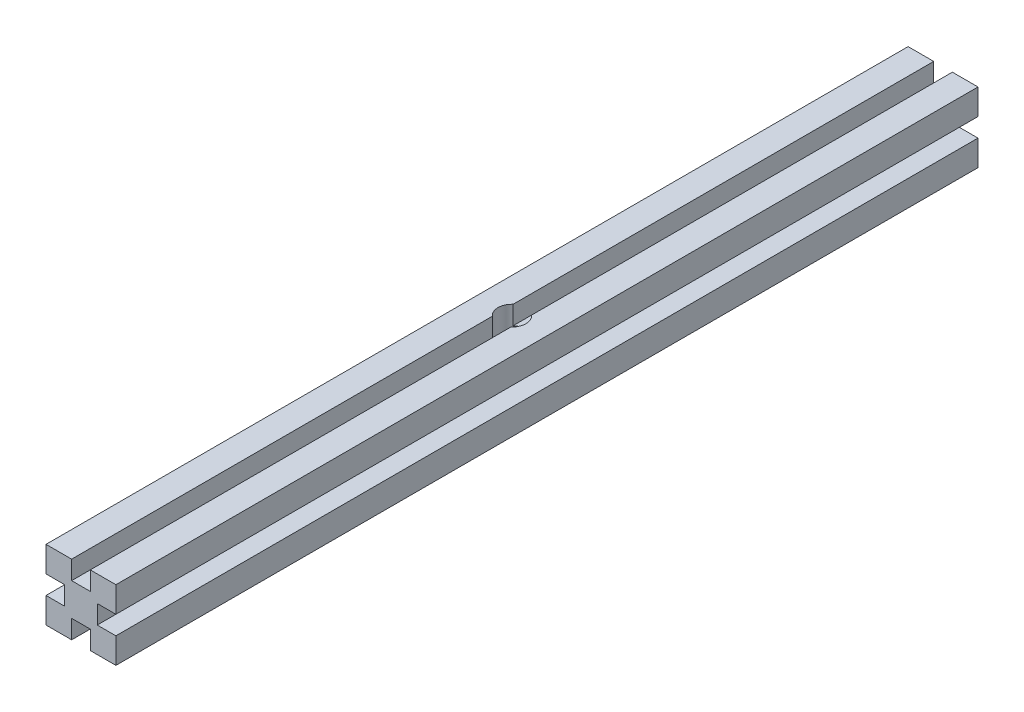
ISO-10303-21;
HEADER;
FILE_DESCRIPTION(('STEP AP214'),'2;1');
FILE_NAME('part.step','',(''),(''),'','','');
FILE_SCHEMA(('AUTOMOTIVE_DESIGN { 1 0 10303 214 1 1 1 1 }'));
ENDSEC;
DATA;
#1=APPLICATION_CONTEXT('core data for automotive mechanical design processes');
#2=APPLICATION_PROTOCOL_DEFINITION('international standard','automotive_design',2000,#1);
#3=PRODUCT_CONTEXT('',#1,'mechanical');
#4=PRODUCT('Part','Part','',(#3));
#5=PRODUCT_RELATED_PRODUCT_CATEGORY('part','',(#4));
#6=PRODUCT_DEFINITION_FORMATION('','',#4);
#7=PRODUCT_DEFINITION_CONTEXT('part definition',#1,'design');
#8=PRODUCT_DEFINITION('design','',#6,#7);
#9=PRODUCT_DEFINITION_SHAPE('','',#8);
#10=(LENGTH_UNIT() NAMED_UNIT(*) SI_UNIT(.MILLI.,.METRE.));
#11=(NAMED_UNIT(*) PLANE_ANGLE_UNIT() SI_UNIT($,.RADIAN.));
#12=(NAMED_UNIT(*) SI_UNIT($,.STERADIAN.) SOLID_ANGLE_UNIT());
#13=UNCERTAINTY_MEASURE_WITH_UNIT(LENGTH_MEASURE(1.E-05),#10,'distance_accuracy_value','');
#14=(GEOMETRIC_REPRESENTATION_CONTEXT(3) GLOBAL_UNCERTAINTY_ASSIGNED_CONTEXT((#13)) GLOBAL_UNIT_ASSIGNED_CONTEXT((#10,
#11,#12)) REPRESENTATION_CONTEXT('',''));
#15=CARTESIAN_POINT('',(0.,0.,0.));
#16=DIRECTION('',(0.,0.,1.));
#17=DIRECTION('',(1.,0.,0.));
#18=AXIS2_PLACEMENT_3D('',#15,#16,#17);
#19=CARTESIAN_POINT('',(4.,-7.,185.));
#20=DIRECTION('',(0.,1.,0.));
#21=DIRECTION('',(0.,0.,1.));
#22=AXIS2_PLACEMENT_3D('',#19,#20,#21);
#23=PLANE('',#22);
#24=DIRECTION('',(1.,0.,0.));
#25=VECTOR('',#24,1.);
#26=CARTESIAN_POINT('',(0.,-7.,-185.));
#27=LINE('',#26,#25);
#28=CARTESIAN_POINT('',(-4.,-7.,-185.));
#29=VERTEX_POINT('',#28);
#30=CARTESIAN_POINT('',(4.,-7.,-185.));
#31=VERTEX_POINT('',#30);
#32=EDGE_CURVE('E240',#29,#31,#27,.T.);
#33=ORIENTED_EDGE('',*,*,#32,.T.);
#34=DIRECTION('',(0.,0.,-1.));
#35=VECTOR('',#34,1.);
#36=CARTESIAN_POINT('',(4.,-7.,185.));
#37=LINE('',#36,#35);
#38=CARTESIAN_POINT('',(3.9999999999999,-7.,-4.47213595499967));
#39=VERTEX_POINT('',#38);
#40=EDGE_CURVE('E200',#31,#39,#37,.F.);
#41=ORIENTED_EDGE('',*,*,#40,.T.);
#42=CARTESIAN_POINT('',(0.,-7.,0.));
#43=DIRECTION('',(0.,1.,0.));
#44=DIRECTION('',(0.,0.,1.));
#45=AXIS2_PLACEMENT_3D('',#42,#43,#44);
#46=CIRCLE('',#45,6.);
#47=CARTESIAN_POINT('',(-3.9999999999999,-7.,-4.47213595499967));
#48=VERTEX_POINT('',#47);
#49=EDGE_CURVE('E20',#39,#48,#46,.T.);
#50=ORIENTED_EDGE('',*,*,#49,.T.);
#51=DIRECTION('',(0.,0.,1.));
#52=VECTOR('',#51,1.);
#53=CARTESIAN_POINT('',(-4.,-7.,185.));
#54=LINE('',#53,#52);
#55=EDGE_CURVE('E204',#48,#29,#54,.F.);
#56=ORIENTED_EDGE('',*,*,#55,.T.);
#57=EDGE_LOOP('',(#33,#41,#50,#56));
#58=FACE_BOUND('',#57,.T.);
#59=ADVANCED_FACE('F17',(#58),#23,.F.);
#60=CARTESIAN_POINT('',(4.,-15.,185.));
#61=DIRECTION('',(1.,0.,0.));
#62=DIRECTION('',(0.,0.,-1.));
#63=AXIS2_PLACEMENT_3D('',#60,#61,#62);
#64=PLANE('',#63);
#65=DIRECTION('',(0.,1.,0.));
#66=VECTOR('',#65,1.);
#67=CARTESIAN_POINT('',(4.,0.,-185.));
#68=LINE('',#67,#66);
#69=CARTESIAN_POINT('',(4.,-15.,-185.));
#70=VERTEX_POINT('',#69);
#71=EDGE_CURVE('E276',#31,#70,#68,.F.);
#72=ORIENTED_EDGE('',*,*,#71,.T.);
#73=DIRECTION('',(0.,0.,-1.));
#74=VECTOR('',#73,1.);
#75=CARTESIAN_POINT('',(4.,-15.,-185.));
#76=LINE('',#75,#74);
#77=CARTESIAN_POINT('',(3.9999999999999,-15.,-4.47213595499967));
#78=VERTEX_POINT('',#77);
#79=EDGE_CURVE('E369',#78,#70,#76,.T.);
#80=ORIENTED_EDGE('',*,*,#79,.F.);
#81=DIRECTION('',(0.,1.,0.));
#82=VECTOR('',#81,1.);
#83=CARTESIAN_POINT('',(3.99999999999979,-15.,-4.47213595499977));
#84=LINE('',#83,#82);
#85=EDGE_CURVE('E210',#78,#39,#84,.T.);
#86=ORIENTED_EDGE('',*,*,#85,.T.);
#87=ORIENTED_EDGE('',*,*,#40,.F.);
#88=EDGE_LOOP('',(#72,#80,#86,#87));
#89=FACE_BOUND('',#88,.T.);
#90=ADVANCED_FACE('F551',(#89),#64,.F.);
#91=CARTESIAN_POINT('',(4.,7.,185.));
#92=DIRECTION('',(1.,0.,0.));
#93=DIRECTION('',(0.,0.,-1.));
#94=AXIS2_PLACEMENT_3D('',#91,#92,#93);
#95=PLANE('',#94);
#96=DIRECTION('',(0.,1.,0.));
#97=VECTOR('',#96,1.);
#98=CARTESIAN_POINT('',(4.,0.,-185.));
#99=LINE('',#98,#97);
#100=CARTESIAN_POINT('',(4.,15.,-185.));
#101=VERTEX_POINT('',#100);
#102=CARTESIAN_POINT('',(4.,7.,-185.));
#103=VERTEX_POINT('',#102);
#104=EDGE_CURVE('E337',#101,#103,#99,.F.);
#105=ORIENTED_EDGE('',*,*,#104,.T.);
#106=DIRECTION('',(0.,0.,-1.));
#107=VECTOR('',#106,1.);
#108=CARTESIAN_POINT('',(4.,7.,185.));
#109=LINE('',#108,#107);
#110=CARTESIAN_POINT('',(3.9999999999999,7.,-4.47213595499967));
#111=VERTEX_POINT('',#110);
#112=EDGE_CURVE('E269',#103,#111,#109,.F.);
#113=ORIENTED_EDGE('',*,*,#112,.T.);
#114=DIRECTION('',(0.,1.,0.));
#115=VECTOR('',#114,1.);
#116=CARTESIAN_POINT('',(3.99999999999979,-15.,-4.47213595499977));
#117=LINE('',#116,#115);
#118=CARTESIAN_POINT('',(3.9999999999999,15.,-4.47213595499967));
#119=VERTEX_POINT('',#118);
#120=EDGE_CURVE('E257',#111,#119,#117,.T.);
#121=ORIENTED_EDGE('',*,*,#120,.T.);
#122=DIRECTION('',(0.,0.,1.));
#123=VECTOR('',#122,1.);
#124=CARTESIAN_POINT('',(4.,15.,-185.));
#125=LINE('',#124,#123);
#126=EDGE_CURVE('E393',#101,#119,#125,.T.);
#127=ORIENTED_EDGE('',*,*,#126,.F.);
#128=EDGE_LOOP('',(#105,#113,#121,#127));
#129=FACE_BOUND('',#128,.T.);
#130=ADVANCED_FACE('F410',(#129),#95,.F.);
#131=CARTESIAN_POINT('',(-4.,7.,185.));
#132=DIRECTION('',(0.,-1.,0.));
#133=DIRECTION('',(0.,0.,-1.));
#134=AXIS2_PLACEMENT_3D('',#131,#132,#133);
#135=PLANE('',#134);
#136=DIRECTION('',(1.,0.,0.));
#137=VECTOR('',#136,1.);
#138=CARTESIAN_POINT('',(0.,7.,-185.));
#139=LINE('',#138,#137);
#140=CARTESIAN_POINT('',(-4.,7.,-185.));
#141=VERTEX_POINT('',#140);
#142=EDGE_CURVE('E298',#103,#141,#139,.F.);
#143=ORIENTED_EDGE('',*,*,#142,.T.);
#144=DIRECTION('',(0.,0.,1.));
#145=VECTOR('',#144,1.);
#146=CARTESIAN_POINT('',(-4.,7.,185.));
#147=LINE('',#146,#145);
#148=CARTESIAN_POINT('',(-3.9999999999999,7.,-4.47213595499967));
#149=VERTEX_POINT('',#148);
#150=EDGE_CURVE('E218',#141,#149,#147,.T.);
#151=ORIENTED_EDGE('',*,*,#150,.T.);
#152=CARTESIAN_POINT('',(0.,7.,0.));
#153=DIRECTION('',(0.,1.,0.));
#154=DIRECTION('',(0.,0.,1.));
#155=AXIS2_PLACEMENT_3D('',#152,#153,#154);
#156=CIRCLE('',#155,6.);
#157=EDGE_CURVE('E226',#149,#111,#156,.F.);
#158=ORIENTED_EDGE('',*,*,#157,.T.);
#159=ORIENTED_EDGE('',*,*,#112,.F.);
#160=EDGE_LOOP('',(#143,#151,#158,#159));
#161=FACE_BOUND('',#160,.T.);
#162=ADVANCED_FACE('F403',(#161),#135,.F.);
#163=CARTESIAN_POINT('',(-4.,15.,185.));
#164=DIRECTION('',(-1.,0.,0.));
#165=DIRECTION('',(0.,0.,1.));
#166=AXIS2_PLACEMENT_3D('',#163,#164,#165);
#167=PLANE('',#166);
#168=DIRECTION('',(0.,1.,0.));
#169=VECTOR('',#168,1.);
#170=CARTESIAN_POINT('',(-4.,0.,-185.));
#171=LINE('',#170,#169);
#172=CARTESIAN_POINT('',(-4.,15.,-185.));
#173=VERTEX_POINT('',#172);
#174=EDGE_CURVE('E295',#141,#173,#171,.T.);
#175=ORIENTED_EDGE('',*,*,#174,.T.);
#176=DIRECTION('',(0.,0.,1.));
#177=VECTOR('',#176,1.);
#178=CARTESIAN_POINT('',(-4.,15.,-185.));
#179=LINE('',#178,#177);
#180=CARTESIAN_POINT('',(-3.9999999999999,15.,-4.47213595499967));
#181=VERTEX_POINT('',#180);
#182=EDGE_CURVE('E306',#181,#173,#179,.F.);
#183=ORIENTED_EDGE('',*,*,#182,.F.);
#184=DIRECTION('',(0.,1.,0.));
#185=VECTOR('',#184,1.);
#186=CARTESIAN_POINT('',(-3.99999999999979,-15.,-4.47213595499977));
#187=LINE('',#186,#185);
#188=EDGE_CURVE('E223',#181,#149,#187,.F.);
#189=ORIENTED_EDGE('',*,*,#188,.T.);
#190=ORIENTED_EDGE('',*,*,#150,.F.);
#191=EDGE_LOOP('',(#175,#183,#189,#190));
#192=FACE_BOUND('',#191,.T.);
#193=ADVANCED_FACE('F517',(#192),#167,.F.);
#194=CARTESIAN_POINT('',(-4.,-7.,185.));
#195=DIRECTION('',(-1.,0.,0.));
#196=DIRECTION('',(0.,0.,1.));
#197=AXIS2_PLACEMENT_3D('',#194,#195,#196);
#198=PLANE('',#197);
#199=DIRECTION('',(0.,1.,0.));
#200=VECTOR('',#199,1.);
#201=CARTESIAN_POINT('',(-4.,0.,-185.));
#202=LINE('',#201,#200);
#203=CARTESIAN_POINT('',(-4.,-15.,-185.));
#204=VERTEX_POINT('',#203);
#205=EDGE_CURVE('E216',#204,#29,#202,.T.);
#206=ORIENTED_EDGE('',*,*,#205,.T.);
#207=ORIENTED_EDGE('',*,*,#55,.F.);
#208=DIRECTION('',(0.,1.,0.));
#209=VECTOR('',#208,1.);
#210=CARTESIAN_POINT('',(-3.99999999999979,-15.,-4.47213595499977));
#211=LINE('',#210,#209);
#212=CARTESIAN_POINT('',(-3.9999999999999,-15.,-4.47213595499967));
#213=VERTEX_POINT('',#212);
#214=EDGE_CURVE('E209',#48,#213,#211,.F.);
#215=ORIENTED_EDGE('',*,*,#214,.T.);
#216=DIRECTION('',(0.,0.,-1.));
#217=VECTOR('',#216,1.);
#218=CARTESIAN_POINT('',(-4.,-15.,-185.));
#219=LINE('',#218,#217);
#220=EDGE_CURVE('E235',#204,#213,#219,.F.);
#221=ORIENTED_EDGE('',*,*,#220,.F.);
#222=EDGE_LOOP('',(#206,#207,#215,#221));
#223=FACE_BOUND('',#222,.T.);
#224=ADVANCED_FACE('F213',(#223),#198,.F.);
#225=CARTESIAN_POINT('',(0.,-15.,0.));
#226=DIRECTION('',(0.,1.,0.));
#227=DIRECTION('',(0.,0.,1.));
#228=AXIS2_PLACEMENT_3D('',#225,#226,#227);
#229=CYLINDRICAL_SURFACE('',#228,6.);
#230=CARTESIAN_POINT('',(0.,15.,0.));
#231=DIRECTION('',(0.,1.,0.));
#232=DIRECTION('',(0.,0.,1.));
#233=AXIS2_PLACEMENT_3D('',#230,#231,#232);
#234=CIRCLE('',#233,6.);
#235=CARTESIAN_POINT('',(4.,15.,4.4721359549998));
#236=VERTEX_POINT('',#235);
#237=EDGE_CURVE('E317',#119,#236,#234,.F.);
#238=ORIENTED_EDGE('',*,*,#237,.F.);
#239=ORIENTED_EDGE('',*,*,#120,.F.);
#240=ORIENTED_EDGE('',*,*,#157,.F.);
#241=ORIENTED_EDGE('',*,*,#188,.F.);
#242=CARTESIAN_POINT('',(0.,15.,0.));
#243=DIRECTION('',(0.,1.,0.));
#244=DIRECTION('',(0.,0.,1.));
#245=AXIS2_PLACEMENT_3D('',#242,#243,#244);
#246=CIRCLE('',#245,6.);
#247=CARTESIAN_POINT('',(-4.,15.,4.4721359549998));
#248=VERTEX_POINT('',#247);
#249=EDGE_CURVE('E386',#248,#181,#246,.F.);
#250=ORIENTED_EDGE('',*,*,#249,.F.);
#251=DIRECTION('',(0.,1.,0.));
#252=VECTOR('',#251,1.);
#253=CARTESIAN_POINT('',(-4.,15.,4.47213595500001));
#254=LINE('',#253,#252);
#255=CARTESIAN_POINT('',(-4.,7.,4.4721359549998));
#256=VERTEX_POINT('',#255);
#257=EDGE_CURVE('E279',#248,#256,#254,.F.);
#258=ORIENTED_EDGE('',*,*,#257,.T.);
#259=CARTESIAN_POINT('',(0.,7.,0.));
#260=DIRECTION('',(0.,1.,0.));
#261=DIRECTION('',(0.,0.,1.));
#262=AXIS2_PLACEMENT_3D('',#259,#260,#261);
#263=CIRCLE('',#262,6.);
#264=CARTESIAN_POINT('',(4.,7.,4.4721359549998));
#265=VERTEX_POINT('',#264);
#266=EDGE_CURVE('E324',#256,#265,#263,.T.);
#267=ORIENTED_EDGE('',*,*,#266,.T.);
#268=DIRECTION('',(0.,1.,0.));
#269=VECTOR('',#268,1.);
#270=CARTESIAN_POINT('',(4.,7.,4.47213595500001));
#271=LINE('',#270,#269);
#272=EDGE_CURVE('E314',#265,#236,#271,.T.);
#273=ORIENTED_EDGE('',*,*,#272,.T.);
#274=EDGE_LOOP('',(#238,#239,#240,#241,#250,#258,#267,#273));
#275=FACE_BOUND('',#274,.T.);
#276=ORIENTED_EDGE('',*,*,#85,.F.);
#277=CARTESIAN_POINT('',(0.,-15.,0.));
#278=DIRECTION('',(0.,1.,0.));
#279=DIRECTION('',(0.,0.,1.));
#280=AXIS2_PLACEMENT_3D('',#277,#278,#279);
#281=CIRCLE('',#280,6.);
#282=CARTESIAN_POINT('',(4.,-15.,4.4721359549998));
#283=VERTEX_POINT('',#282);
#284=EDGE_CURVE('E394',#283,#78,#281,.T.);
#285=ORIENTED_EDGE('',*,*,#284,.F.);
#286=DIRECTION('',(0.,1.,0.));
#287=VECTOR('',#286,1.);
#288=CARTESIAN_POINT('',(4.,-15.,4.47213595500001));
#289=LINE('',#288,#287);
#290=CARTESIAN_POINT('',(4.,-7.,4.4721359549998));
#291=VERTEX_POINT('',#290);
#292=EDGE_CURVE('E344',#283,#291,#289,.T.);
#293=ORIENTED_EDGE('',*,*,#292,.T.);
#294=CARTESIAN_POINT('',(0.,-7.,0.));
#295=DIRECTION('',(0.,1.,0.));
#296=DIRECTION('',(0.,0.,1.));
#297=AXIS2_PLACEMENT_3D('',#294,#295,#296);
#298=CIRCLE('',#297,6.);
#299=CARTESIAN_POINT('',(-4.,-7.,4.4721359549998));
#300=VERTEX_POINT('',#299);
#301=EDGE_CURVE('E256',#291,#300,#298,.F.);
#302=ORIENTED_EDGE('',*,*,#301,.T.);
#303=DIRECTION('',(0.,1.,0.));
#304=VECTOR('',#303,1.);
#305=CARTESIAN_POINT('',(-4.,-7.,4.47213595500001));
#306=LINE('',#305,#304);
#307=CARTESIAN_POINT('',(-4.,-15.,4.4721359549998));
#308=VERTEX_POINT('',#307);
#309=EDGE_CURVE('E254',#300,#308,#306,.F.);
#310=ORIENTED_EDGE('',*,*,#309,.T.);
#311=CARTESIAN_POINT('',(0.,-15.,0.));
#312=DIRECTION('',(0.,1.,0.));
#313=DIRECTION('',(0.,0.,1.));
#314=AXIS2_PLACEMENT_3D('',#311,#312,#313);
#315=CIRCLE('',#314,6.);
#316=EDGE_CURVE('E222',#213,#308,#315,.T.);
#317=ORIENTED_EDGE('',*,*,#316,.F.);
#318=ORIENTED_EDGE('',*,*,#214,.F.);
#319=ORIENTED_EDGE('',*,*,#49,.F.);
#320=EDGE_LOOP('',(#276,#285,#293,#302,#310,#317,#318,#319));
#321=FACE_BOUND('',#320,.T.);
#322=ADVANCED_FACE('F220',(#275,#321),#229,.F.);
#323=CARTESIAN_POINT('',(-4.,-7.,185.));
#324=DIRECTION('',(-1.,0.,0.));
#325=DIRECTION('',(0.,0.,1.));
#326=AXIS2_PLACEMENT_3D('',#323,#324,#325);
#327=PLANE('',#326);
#328=DIRECTION('',(0.,1.,0.));
#329=VECTOR('',#328,1.);
#330=CARTESIAN_POINT('',(-4.,0.,185.));
#331=LINE('',#330,#329);
#332=CARTESIAN_POINT('',(-4.,-15.,185.));
#333=VERTEX_POINT('',#332);
#334=CARTESIAN_POINT('',(-4.,-7.,185.));
#335=VERTEX_POINT('',#334);
#336=EDGE_CURVE('E258',#333,#335,#331,.T.);
#337=ORIENTED_EDGE('',*,*,#336,.F.);
#338=DIRECTION('',(0.,0.,-1.));
#339=VECTOR('',#338,1.);
#340=CARTESIAN_POINT('',(-4.,-15.,-185.));
#341=LINE('',#340,#339);
#342=EDGE_CURVE('E236',#308,#333,#341,.F.);
#343=ORIENTED_EDGE('',*,*,#342,.F.);
#344=ORIENTED_EDGE('',*,*,#309,.F.);
#345=DIRECTION('',(0.,0.,1.));
#346=VECTOR('',#345,1.);
#347=CARTESIAN_POINT('',(-4.,-7.,185.));
#348=LINE('',#347,#346);
#349=EDGE_CURVE('E347',#300,#335,#348,.T.);
#350=ORIENTED_EDGE('',*,*,#349,.T.);
#351=EDGE_LOOP('',(#337,#343,#344,#350));
#352=FACE_BOUND('',#351,.T.);
#353=ADVANCED_FACE('F449',(#352),#327,.F.);
#354=CARTESIAN_POINT('',(4.,-7.,185.));
#355=DIRECTION('',(0.,1.,0.));
#356=DIRECTION('',(0.,0.,1.));
#357=AXIS2_PLACEMENT_3D('',#354,#355,#356);
#358=PLANE('',#357);
#359=DIRECTION('',(1.,0.,0.));
#360=VECTOR('',#359,1.);
#361=CARTESIAN_POINT('',(0.,-7.,185.));
#362=LINE('',#361,#360);
#363=CARTESIAN_POINT('',(4.,-7.,185.));
#364=VERTEX_POINT('',#363);
#365=EDGE_CURVE('E261',#335,#364,#362,.T.);
#366=ORIENTED_EDGE('',*,*,#365,.F.);
#367=ORIENTED_EDGE('',*,*,#349,.F.);
#368=ORIENTED_EDGE('',*,*,#301,.F.);
#369=DIRECTION('',(0.,0.,-1.));
#370=VECTOR('',#369,1.);
#371=CARTESIAN_POINT('',(4.,-7.,185.));
#372=LINE('',#371,#370);
#373=EDGE_CURVE('E346',#291,#364,#372,.F.);
#374=ORIENTED_EDGE('',*,*,#373,.T.);
#375=EDGE_LOOP('',(#366,#367,#368,#374));
#376=FACE_BOUND('',#375,.T.);
#377=ADVANCED_FACE('F453',(#376),#358,.F.);
#378=CARTESIAN_POINT('',(4.,-15.,185.));
#379=DIRECTION('',(1.,0.,0.));
#380=DIRECTION('',(0.,0.,-1.));
#381=AXIS2_PLACEMENT_3D('',#378,#379,#380);
#382=PLANE('',#381);
#383=DIRECTION('',(0.,1.,0.));
#384=VECTOR('',#383,1.);
#385=CARTESIAN_POINT('',(4.,0.,185.));
#386=LINE('',#385,#384);
#387=CARTESIAN_POINT('',(4.,-15.,185.));
#388=VERTEX_POINT('',#387);
#389=EDGE_CURVE('E352',#364,#388,#386,.F.);
#390=ORIENTED_EDGE('',*,*,#389,.F.);
#391=ORIENTED_EDGE('',*,*,#373,.F.);
#392=ORIENTED_EDGE('',*,*,#292,.F.);
#393=DIRECTION('',(0.,0.,-1.));
#394=VECTOR('',#393,1.);
#395=CARTESIAN_POINT('',(4.,-15.,-185.));
#396=LINE('',#395,#394);
#397=EDGE_CURVE('E397',#388,#283,#396,.T.);
#398=ORIENTED_EDGE('',*,*,#397,.F.);
#399=EDGE_LOOP('',(#390,#391,#392,#398));
#400=FACE_BOUND('',#399,.T.);
#401=ADVANCED_FACE('F558',(#400),#382,.F.);
#402=CARTESIAN_POINT('',(-15.,-15.,-185.));
#403=DIRECTION('',(0.,-1.,0.));
#404=DIRECTION('',(0.,0.,-1.));
#405=AXIS2_PLACEMENT_3D('',#402,#403,#404);
#406=PLANE('',#405);
#407=ORIENTED_EDGE('',*,*,#397,.T.);
#408=ORIENTED_EDGE('',*,*,#284,.T.);
#409=ORIENTED_EDGE('',*,*,#79,.T.);
#410=DIRECTION('',(1.,0.,0.));
#411=VECTOR('',#410,1.);
#412=CARTESIAN_POINT('',(0.,-15.,-185.));
#413=LINE('',#412,#411);
#414=CARTESIAN_POINT('',(15.,-15.,-185.));
#415=VERTEX_POINT('',#414);
#416=EDGE_CURVE('E360',#70,#415,#413,.T.);
#417=ORIENTED_EDGE('',*,*,#416,.T.);
#418=DIRECTION('',(0.,0.,-1.));
#419=VECTOR('',#418,1.);
#420=CARTESIAN_POINT('',(15.,-15.,-185.));
#421=LINE('',#420,#419);
#422=CARTESIAN_POINT('',(15.,-15.,185.));
#423=VERTEX_POINT('',#422);
#424=EDGE_CURVE('E396',#423,#415,#421,.T.);
#425=ORIENTED_EDGE('',*,*,#424,.F.);
#426=DIRECTION('',(1.,0.,0.));
#427=VECTOR('',#426,1.);
#428=CARTESIAN_POINT('',(0.,-15.,185.));
#429=LINE('',#428,#427);
#430=EDGE_CURVE('E348',#388,#423,#429,.T.);
#431=ORIENTED_EDGE('',*,*,#430,.F.);
#432=EDGE_LOOP('',(#407,#408,#409,#417,#425,#431));
#433=FACE_BOUND('',#432,.T.);
#434=ADVANCED_FACE('F556',(#433),#406,.T.);
#435=CARTESIAN_POINT('',(15.,-15.,-185.));
#436=DIRECTION('',(1.,0.,0.));
#437=DIRECTION('',(0.,0.,-1.));
#438=AXIS2_PLACEMENT_3D('',#435,#436,#437);
#439=PLANE('',#438);
#440=DIRECTION('',(0.,1.,0.));
#441=VECTOR('',#440,1.);
#442=CARTESIAN_POINT('',(15.,0.,-185.));
#443=LINE('',#442,#441);
#444=CARTESIAN_POINT('',(15.,-4.,-185.));
#445=VERTEX_POINT('',#444);
#446=EDGE_CURVE('E364',#415,#445,#443,.T.);
#447=ORIENTED_EDGE('',*,*,#446,.T.);
#448=DIRECTION('',(0.,0.,-1.));
#449=VECTOR('',#448,1.);
#450=CARTESIAN_POINT('',(15.,-4.,185.));
#451=LINE('',#450,#449);
#452=CARTESIAN_POINT('',(15.,-4.,185.));
#453=VERTEX_POINT('',#452);
#454=EDGE_CURVE('E433',#445,#453,#451,.F.);
#455=ORIENTED_EDGE('',*,*,#454,.T.);
#456=DIRECTION('',(0.,1.,0.));
#457=VECTOR('',#456,1.);
#458=CARTESIAN_POINT('',(15.,0.,185.));
#459=LINE('',#458,#457);
#460=EDGE_CURVE('E351',#423,#453,#459,.T.);
#461=ORIENTED_EDGE('',*,*,#460,.F.);
#462=ORIENTED_EDGE('',*,*,#424,.T.);
#463=EDGE_LOOP('',(#447,#455,#461,#462));
#464=FACE_BOUND('',#463,.T.);
#465=ADVANCED_FACE('F562',(#464),#439,.T.);
#466=CARTESIAN_POINT('',(7.,-4.,185.));
#467=DIRECTION('',(0.,-1.,0.));
#468=DIRECTION('',(0.,0.,-1.));
#469=AXIS2_PLACEMENT_3D('',#466,#467,#468);
#470=PLANE('',#469);
#471=DIRECTION('',(1.,0.,0.));
#472=VECTOR('',#471,1.);
#473=CARTESIAN_POINT('',(0.,-4.,185.));
#474=LINE('',#473,#472);
#475=CARTESIAN_POINT('',(7.,-4.,185.));
#476=VERTEX_POINT('',#475);
#477=EDGE_CURVE('E542',#453,#476,#474,.F.);
#478=ORIENTED_EDGE('',*,*,#477,.F.);
#479=ORIENTED_EDGE('',*,*,#454,.F.);
#480=DIRECTION('',(1.,0.,0.));
#481=VECTOR('',#480,1.);
#482=CARTESIAN_POINT('',(0.,-4.,-185.));
#483=LINE('',#482,#481);
#484=CARTESIAN_POINT('',(7.,-4.,-185.));
#485=VERTEX_POINT('',#484);
#486=EDGE_CURVE('E478',#445,#485,#483,.F.);
#487=ORIENTED_EDGE('',*,*,#486,.T.);
#488=DIRECTION('',(0.,0.,1.));
#489=VECTOR('',#488,1.);
#490=CARTESIAN_POINT('',(7.,-4.,185.));
#491=LINE('',#490,#489);
#492=EDGE_CURVE('E431',#485,#476,#491,.T.);
#493=ORIENTED_EDGE('',*,*,#492,.T.);
#494=EDGE_LOOP('',(#478,#479,#487,#493));
#495=FACE_BOUND('',#494,.T.);
#496=ADVANCED_FACE('F567',(#495),#470,.F.);
#497=CARTESIAN_POINT('',(7.,4.,185.));
#498=DIRECTION('',(-1.,0.,0.));
#499=DIRECTION('',(0.,0.,1.));
#500=AXIS2_PLACEMENT_3D('',#497,#498,#499);
#501=PLANE('',#500);
#502=DIRECTION('',(0.,1.,0.));
#503=VECTOR('',#502,1.);
#504=CARTESIAN_POINT('',(7.,0.,185.));
#505=LINE('',#504,#503);
#506=CARTESIAN_POINT('',(7.,4.,185.));
#507=VERTEX_POINT('',#506);
#508=EDGE_CURVE('E539',#476,#507,#505,.T.);
#509=ORIENTED_EDGE('',*,*,#508,.F.);
#510=ORIENTED_EDGE('',*,*,#492,.F.);
#511=DIRECTION('',(0.,1.,0.));
#512=VECTOR('',#511,1.);
#513=CARTESIAN_POINT('',(7.,0.,-185.));
#514=LINE('',#513,#512);
#515=CARTESIAN_POINT('',(7.,4.,-185.));
#516=VERTEX_POINT('',#515);
#517=EDGE_CURVE('E476',#485,#516,#514,.T.);
#518=ORIENTED_EDGE('',*,*,#517,.T.);
#519=DIRECTION('',(0.,0.,1.));
#520=VECTOR('',#519,1.);
#521=CARTESIAN_POINT('',(7.,4.,185.));
#522=LINE('',#521,#520);
#523=EDGE_CURVE('E429',#516,#507,#522,.T.);
#524=ORIENTED_EDGE('',*,*,#523,.T.);
#525=EDGE_LOOP('',(#509,#510,#518,#524));
#526=FACE_BOUND('',#525,.T.);
#527=ADVANCED_FACE('F572',(#526),#501,.F.);
#528=CARTESIAN_POINT('',(15.,4.,185.));
#529=DIRECTION('',(0.,1.,0.));
#530=DIRECTION('',(0.,0.,1.));
#531=AXIS2_PLACEMENT_3D('',#528,#529,#530);
#532=PLANE('',#531);
#533=DIRECTION('',(1.,0.,0.));
#534=VECTOR('',#533,1.);
#535=CARTESIAN_POINT('',(0.,4.,185.));
#536=LINE('',#535,#534);
#537=CARTESIAN_POINT('',(15.,4.,185.));
#538=VERTEX_POINT('',#537);
#539=EDGE_CURVE('E537',#507,#538,#536,.T.);
#540=ORIENTED_EDGE('',*,*,#539,.F.);
#541=ORIENTED_EDGE('',*,*,#523,.F.);
#542=DIRECTION('',(1.,0.,0.));
#543=VECTOR('',#542,1.);
#544=CARTESIAN_POINT('',(0.,4.,-185.));
#545=LINE('',#544,#543);
#546=CARTESIAN_POINT('',(15.,4.,-185.));
#547=VERTEX_POINT('',#546);
#548=EDGE_CURVE('E474',#516,#547,#545,.T.);
#549=ORIENTED_EDGE('',*,*,#548,.T.);
#550=DIRECTION('',(0.,0.,-1.));
#551=VECTOR('',#550,1.);
#552=CARTESIAN_POINT('',(15.,4.,-185.));
#553=LINE('',#552,#551);
#554=EDGE_CURVE('E419',#538,#547,#553,.T.);
#555=ORIENTED_EDGE('',*,*,#554,.F.);
#556=EDGE_LOOP('',(#540,#541,#549,#555));
#557=FACE_BOUND('',#556,.T.);
#558=ADVANCED_FACE('F576',(#557),#532,.F.);
#559=CARTESIAN_POINT('',(15.,-15.,-185.));
#560=DIRECTION('',(1.,0.,0.));
#561=DIRECTION('',(0.,0.,-1.));
#562=AXIS2_PLACEMENT_3D('',#559,#560,#561);
#563=PLANE('',#562);
#564=DIRECTION('',(0.,1.,0.));
#565=VECTOR('',#564,1.);
#566=CARTESIAN_POINT('',(15.,0.,185.));
#567=LINE('',#566,#565);
#568=CARTESIAN_POINT('',(15.,15.,185.));
#569=VERTEX_POINT('',#568);
#570=EDGE_CURVE('E329',#538,#569,#567,.T.);
#571=ORIENTED_EDGE('',*,*,#570,.F.);
#572=ORIENTED_EDGE('',*,*,#554,.T.);
#573=DIRECTION('',(0.,1.,0.));
#574=VECTOR('',#573,1.);
#575=CARTESIAN_POINT('',(15.,0.,-185.));
#576=LINE('',#575,#574);
#577=CARTESIAN_POINT('',(15.,15.,-185.));
#578=VERTEX_POINT('',#577);
#579=EDGE_CURVE('E338',#547,#578,#576,.T.);
#580=ORIENTED_EDGE('',*,*,#579,.T.);
#581=DIRECTION('',(0.,0.,1.));
#582=VECTOR('',#581,1.);
#583=CARTESIAN_POINT('',(15.,15.,-185.));
#584=LINE('',#583,#582);
#585=EDGE_CURVE('E417',#569,#578,#584,.F.);
#586=ORIENTED_EDGE('',*,*,#585,.F.);
#587=EDGE_LOOP('',(#571,#572,#580,#586));
#588=FACE_BOUND('',#587,.T.);
#589=ADVANCED_FACE('F577',(#588),#563,.T.);
#590=CARTESIAN_POINT('',(15.,15.,-185.));
#591=DIRECTION('',(0.,1.,0.));
#592=DIRECTION('',(0.,0.,1.));
#593=AXIS2_PLACEMENT_3D('',#590,#591,#592);
#594=PLANE('',#593);
#595=ORIENTED_EDGE('',*,*,#126,.T.);
#596=ORIENTED_EDGE('',*,*,#237,.T.);
#597=DIRECTION('',(0.,0.,-1.));
#598=VECTOR('',#597,1.);
#599=CARTESIAN_POINT('',(4.,15.,185.));
#600=LINE('',#599,#598);
#601=CARTESIAN_POINT('',(4.,15.,185.));
#602=VERTEX_POINT('',#601);
#603=EDGE_CURVE('E316',#236,#602,#600,.F.);
#604=ORIENTED_EDGE('',*,*,#603,.T.);
#605=DIRECTION('',(1.,0.,0.));
#606=VECTOR('',#605,1.);
#607=CARTESIAN_POINT('',(0.,15.,185.));
#608=LINE('',#607,#606);
#609=EDGE_CURVE('E320',#569,#602,#608,.F.);
#610=ORIENTED_EDGE('',*,*,#609,.F.);
#611=ORIENTED_EDGE('',*,*,#585,.T.);
#612=DIRECTION('',(1.,0.,0.));
#613=VECTOR('',#612,1.);
#614=CARTESIAN_POINT('',(0.,15.,-185.));
#615=LINE('',#614,#613);
#616=EDGE_CURVE('E334',#578,#101,#615,.F.);
#617=ORIENTED_EDGE('',*,*,#616,.T.);
#618=EDGE_LOOP('',(#595,#596,#604,#610,#611,#617));
#619=FACE_BOUND('',#618,.T.);
#620=ADVANCED_FACE('F412',(#619),#594,.T.);
#621=CARTESIAN_POINT('',(4.,7.,185.));
#622=DIRECTION('',(1.,0.,0.));
#623=DIRECTION('',(0.,0.,-1.));
#624=AXIS2_PLACEMENT_3D('',#621,#622,#623);
#625=PLANE('',#624);
#626=DIRECTION('',(0.,1.,0.));
#627=VECTOR('',#626,1.);
#628=CARTESIAN_POINT('',(4.,0.,185.));
#629=LINE('',#628,#627);
#630=CARTESIAN_POINT('',(4.,7.,185.));
#631=VERTEX_POINT('',#630);
#632=EDGE_CURVE('E311',#602,#631,#629,.F.);
#633=ORIENTED_EDGE('',*,*,#632,.F.);
#634=ORIENTED_EDGE('',*,*,#603,.F.);
#635=ORIENTED_EDGE('',*,*,#272,.F.);
#636=DIRECTION('',(0.,0.,-1.));
#637=VECTOR('',#636,1.);
#638=CARTESIAN_POINT('',(4.,7.,185.));
#639=LINE('',#638,#637);
#640=EDGE_CURVE('E282',#265,#631,#639,.F.);
#641=ORIENTED_EDGE('',*,*,#640,.T.);
#642=EDGE_LOOP('',(#633,#634,#635,#641));
#643=FACE_BOUND('',#642,.T.);
#644=ADVANCED_FACE('F498',(#643),#625,.F.);
#645=CARTESIAN_POINT('',(-4.,7.,185.));
#646=DIRECTION('',(0.,-1.,0.));
#647=DIRECTION('',(0.,0.,-1.));
#648=AXIS2_PLACEMENT_3D('',#645,#646,#647);
#649=PLANE('',#648);
#650=DIRECTION('',(1.,0.,0.));
#651=VECTOR('',#650,1.);
#652=CARTESIAN_POINT('',(0.,7.,185.));
#653=LINE('',#652,#651);
#654=CARTESIAN_POINT('',(-4.,7.,185.));
#655=VERTEX_POINT('',#654);
#656=EDGE_CURVE('E292',#631,#655,#653,.F.);
#657=ORIENTED_EDGE('',*,*,#656,.F.);
#658=ORIENTED_EDGE('',*,*,#640,.F.);
#659=ORIENTED_EDGE('',*,*,#266,.F.);
#660=DIRECTION('',(0.,0.,1.));
#661=VECTOR('',#660,1.);
#662=CARTESIAN_POINT('',(-4.,7.,185.));
#663=LINE('',#662,#661);
#664=EDGE_CURVE('E281',#256,#655,#663,.T.);
#665=ORIENTED_EDGE('',*,*,#664,.T.);
#666=EDGE_LOOP('',(#657,#658,#659,#665));
#667=FACE_BOUND('',#666,.T.);
#668=ADVANCED_FACE('F501',(#667),#649,.F.);
#669=CARTESIAN_POINT('',(-4.,15.,185.));
#670=DIRECTION('',(-1.,0.,0.));
#671=DIRECTION('',(0.,0.,1.));
#672=AXIS2_PLACEMENT_3D('',#669,#670,#671);
#673=PLANE('',#672);
#674=DIRECTION('',(0.,1.,0.));
#675=VECTOR('',#674,1.);
#676=CARTESIAN_POINT('',(-4.,0.,185.));
#677=LINE('',#676,#675);
#678=CARTESIAN_POINT('',(-4.,15.,185.));
#679=VERTEX_POINT('',#678);
#680=EDGE_CURVE('E287',#655,#679,#677,.T.);
#681=ORIENTED_EDGE('',*,*,#680,.F.);
#682=ORIENTED_EDGE('',*,*,#664,.F.);
#683=ORIENTED_EDGE('',*,*,#257,.F.);
#684=DIRECTION('',(0.,0.,1.));
#685=VECTOR('',#684,1.);
#686=CARTESIAN_POINT('',(-4.,15.,-185.));
#687=LINE('',#686,#685);
#688=EDGE_CURVE('E389',#679,#248,#687,.F.);
#689=ORIENTED_EDGE('',*,*,#688,.F.);
#690=EDGE_LOOP('',(#681,#682,#683,#689));
#691=FACE_BOUND('',#690,.T.);
#692=ADVANCED_FACE('F524',(#691),#673,.F.);
#693=CARTESIAN_POINT('',(15.,15.,-185.));
#694=DIRECTION('',(0.,1.,0.));
#695=DIRECTION('',(0.,0.,1.));
#696=AXIS2_PLACEMENT_3D('',#693,#694,#695);
#697=PLANE('',#696);
#698=ORIENTED_EDGE('',*,*,#688,.T.);
#699=ORIENTED_EDGE('',*,*,#249,.T.);
#700=ORIENTED_EDGE('',*,*,#182,.T.);
#701=DIRECTION('',(1.,0.,0.));
#702=VECTOR('',#701,1.);
#703=CARTESIAN_POINT('',(0.,15.,-185.));
#704=LINE('',#703,#702);
#705=CARTESIAN_POINT('',(-15.,15.,-185.));
#706=VERTEX_POINT('',#705);
#707=EDGE_CURVE('E297',#173,#706,#704,.F.);
#708=ORIENTED_EDGE('',*,*,#707,.T.);
#709=DIRECTION('',(0.,0.,1.));
#710=VECTOR('',#709,1.);
#711=CARTESIAN_POINT('',(-15.,15.,-185.));
#712=LINE('',#711,#710);
#713=CARTESIAN_POINT('',(-15.,15.,185.));
#714=VERTEX_POINT('',#713);
#715=EDGE_CURVE('E388',#714,#706,#712,.F.);
#716=ORIENTED_EDGE('',*,*,#715,.F.);
#717=DIRECTION('',(1.,0.,0.));
#718=VECTOR('',#717,1.);
#719=CARTESIAN_POINT('',(0.,15.,185.));
#720=LINE('',#719,#718);
#721=EDGE_CURVE('E283',#679,#714,#720,.F.);
#722=ORIENTED_EDGE('',*,*,#721,.F.);
#723=EDGE_LOOP('',(#698,#699,#700,#708,#716,#722));
#724=FACE_BOUND('',#723,.T.);
#725=ADVANCED_FACE('F522',(#724),#697,.T.);
#726=CARTESIAN_POINT('',(-15.,15.,-185.));
#727=DIRECTION('',(-1.,0.,0.));
#728=DIRECTION('',(0.,0.,1.));
#729=AXIS2_PLACEMENT_3D('',#726,#727,#728);
#730=PLANE('',#729);
#731=DIRECTION('',(0.,1.,0.));
#732=VECTOR('',#731,1.);
#733=CARTESIAN_POINT('',(-15.,0.,-185.));
#734=LINE('',#733,#732);
#735=CARTESIAN_POINT('',(-15.,4.,-185.));
#736=VERTEX_POINT('',#735);
#737=EDGE_CURVE('E302',#706,#736,#734,.F.);
#738=ORIENTED_EDGE('',*,*,#737,.T.);
#739=DIRECTION('',(0.,0.,1.));
#740=VECTOR('',#739,1.);
#741=CARTESIAN_POINT('',(-15.,4.,185.));
#742=LINE('',#741,#740);
#743=CARTESIAN_POINT('',(-15.,4.,185.));
#744=VERTEX_POINT('',#743);
#745=EDGE_CURVE('E482',#736,#744,#742,.T.);
#746=ORIENTED_EDGE('',*,*,#745,.T.);
#747=DIRECTION('',(0.,1.,0.));
#748=VECTOR('',#747,1.);
#749=CARTESIAN_POINT('',(-15.,0.,185.));
#750=LINE('',#749,#748);
#751=EDGE_CURVE('E286',#714,#744,#750,.F.);
#752=ORIENTED_EDGE('',*,*,#751,.F.);
#753=ORIENTED_EDGE('',*,*,#715,.T.);
#754=EDGE_LOOP('',(#738,#746,#752,#753));
#755=FACE_BOUND('',#754,.T.);
#756=ADVANCED_FACE('F611',(#755),#730,.T.);
#757=CARTESIAN_POINT('',(-7.,4.,185.));
#758=DIRECTION('',(0.,1.,0.));
#759=DIRECTION('',(0.,0.,1.));
#760=AXIS2_PLACEMENT_3D('',#757,#758,#759);
#761=PLANE('',#760);
#762=DIRECTION('',(1.,0.,0.));
#763=VECTOR('',#762,1.);
#764=CARTESIAN_POINT('',(0.,4.,185.));
#765=LINE('',#764,#763);
#766=CARTESIAN_POINT('',(-7.,4.,185.));
#767=VERTEX_POINT('',#766);
#768=EDGE_CURVE('E529',#744,#767,#765,.T.);
#769=ORIENTED_EDGE('',*,*,#768,.F.);
#770=ORIENTED_EDGE('',*,*,#745,.F.);
#771=DIRECTION('',(1.,0.,0.));
#772=VECTOR('',#771,1.);
#773=CARTESIAN_POINT('',(0.,4.,-185.));
#774=LINE('',#773,#772);
#775=CARTESIAN_POINT('',(-7.,4.,-185.));
#776=VERTEX_POINT('',#775);
#777=EDGE_CURVE('E463',#736,#776,#774,.T.);
#778=ORIENTED_EDGE('',*,*,#777,.T.);
#779=DIRECTION('',(0.,0.,-1.));
#780=VECTOR('',#779,1.);
#781=CARTESIAN_POINT('',(-7.,4.,185.));
#782=LINE('',#781,#780);
#783=EDGE_CURVE('E241',#776,#767,#782,.F.);
#784=ORIENTED_EDGE('',*,*,#783,.T.);
#785=EDGE_LOOP('',(#769,#770,#778,#784));
#786=FACE_BOUND('',#785,.T.);
#787=ADVANCED_FACE('F607',(#786),#761,.F.);
#788=CARTESIAN_POINT('',(-7.,-4.,185.));
#789=DIRECTION('',(1.,0.,0.));
#790=DIRECTION('',(0.,0.,-1.));
#791=AXIS2_PLACEMENT_3D('',#788,#789,#790);
#792=PLANE('',#791);
#793=DIRECTION('',(0.,1.,0.));
#794=VECTOR('',#793,1.);
#795=CARTESIAN_POINT('',(-7.,0.,185.));
#796=LINE('',#795,#794);
#797=CARTESIAN_POINT('',(-7.,-4.,185.));
#798=VERTEX_POINT('',#797);
#799=EDGE_CURVE('E532',#767,#798,#796,.F.);
#800=ORIENTED_EDGE('',*,*,#799,.F.);
#801=ORIENTED_EDGE('',*,*,#783,.F.);
#802=DIRECTION('',(0.,1.,0.));
#803=VECTOR('',#802,1.);
#804=CARTESIAN_POINT('',(-7.,0.,-185.));
#805=LINE('',#804,#803);
#806=CARTESIAN_POINT('',(-7.,-4.,-185.));
#807=VERTEX_POINT('',#806);
#808=EDGE_CURVE('E461',#776,#807,#805,.F.);
#809=ORIENTED_EDGE('',*,*,#808,.T.);
#810=DIRECTION('',(0.,0.,-1.));
#811=VECTOR('',#810,1.);
#812=CARTESIAN_POINT('',(-7.,-4.,185.));
#813=LINE('',#812,#811);
#814=EDGE_CURVE('E832',#807,#798,#813,.F.);
#815=ORIENTED_EDGE('',*,*,#814,.T.);
#816=EDGE_LOOP('',(#800,#801,#809,#815));
#817=FACE_BOUND('',#816,.T.);
#818=ADVANCED_FACE('F604',(#817),#792,.F.);
#819=CARTESIAN_POINT('',(0.,0.,-185.));
#820=DIRECTION('',(0.,0.,1.));
#821=DIRECTION('',(1.,0.,0.));
#822=AXIS2_PLACEMENT_3D('',#819,#820,#821);
#823=PLANE('',#822);
#824=ORIENTED_EDGE('',*,*,#777,.F.);
#825=ORIENTED_EDGE('',*,*,#737,.F.);
#826=ORIENTED_EDGE('',*,*,#707,.F.);
#827=ORIENTED_EDGE('',*,*,#174,.F.);
#828=ORIENTED_EDGE('',*,*,#142,.F.);
#829=ORIENTED_EDGE('',*,*,#104,.F.);
#830=ORIENTED_EDGE('',*,*,#616,.F.);
#831=ORIENTED_EDGE('',*,*,#579,.F.);
#832=ORIENTED_EDGE('',*,*,#548,.F.);
#833=ORIENTED_EDGE('',*,*,#517,.F.);
#834=ORIENTED_EDGE('',*,*,#486,.F.);
#835=ORIENTED_EDGE('',*,*,#446,.F.);
#836=ORIENTED_EDGE('',*,*,#416,.F.);
#837=ORIENTED_EDGE('',*,*,#71,.F.);
#838=ORIENTED_EDGE('',*,*,#32,.F.);
#839=ORIENTED_EDGE('',*,*,#205,.F.);
#840=DIRECTION('',(1.,0.,0.));
#841=VECTOR('',#840,1.);
#842=CARTESIAN_POINT('',(-15.,-15.,-185.));
#843=LINE('',#842,#841);
#844=CARTESIAN_POINT('',(-15.,-15.,-185.));
#845=VERTEX_POINT('',#844);
#846=EDGE_CURVE('E232',#845,#204,#843,.T.);
#847=ORIENTED_EDGE('',*,*,#846,.F.);
#848=DIRECTION('',(0.,1.,0.));
#849=VECTOR('',#848,1.);
#850=CARTESIAN_POINT('',(-15.,15.,-185.));
#851=LINE('',#850,#849);
#852=CARTESIAN_POINT('',(-15.,-4.,-185.));
#853=VERTEX_POINT('',#852);
#854=EDGE_CURVE('E247',#853,#845,#851,.F.);
#855=ORIENTED_EDGE('',*,*,#854,.F.);
#856=DIRECTION('',(1.,0.,0.));
#857=VECTOR('',#856,1.);
#858=CARTESIAN_POINT('',(-15.,-4.,-185.));
#859=LINE('',#858,#857);
#860=EDGE_CURVE('E829',#853,#807,#859,.T.);
#861=ORIENTED_EDGE('',*,*,#860,.T.);
#862=ORIENTED_EDGE('',*,*,#808,.F.);
#863=EDGE_LOOP('',(#824,#825,#826,#827,#828,#829,#830,#831,#832,#833,#834,#835,#836,#837,#838,
#839,#847,#855,#861,#862));
#864=FACE_BOUND('',#863,.T.);
#865=ADVANCED_FACE('F512',(#864),#823,.F.);
#866=CARTESIAN_POINT('',(-15.,-15.,-185.));
#867=DIRECTION('',(0.,-1.,0.));
#868=DIRECTION('',(0.,0.,-1.));
#869=AXIS2_PLACEMENT_3D('',#866,#867,#868);
#870=PLANE('',#869);
#871=ORIENTED_EDGE('',*,*,#220,.T.);
#872=ORIENTED_EDGE('',*,*,#316,.T.);
#873=ORIENTED_EDGE('',*,*,#342,.T.);
#874=DIRECTION('',(1.,0.,0.));
#875=VECTOR('',#874,1.);
#876=CARTESIAN_POINT('',(0.,-15.,185.));
#877=LINE('',#876,#875);
#878=CARTESIAN_POINT('',(-15.,-15.,185.));
#879=VERTEX_POINT('',#878);
#880=EDGE_CURVE('E262',#879,#333,#877,.T.);
#881=ORIENTED_EDGE('',*,*,#880,.F.);
#882=DIRECTION('',(0.,0.,1.));
#883=VECTOR('',#882,1.);
#884=CARTESIAN_POINT('',(-15.,-15.,-185.));
#885=LINE('',#884,#883);
#886=EDGE_CURVE('E244',#845,#879,#885,.T.);
#887=ORIENTED_EDGE('',*,*,#886,.F.);
#888=ORIENTED_EDGE('',*,*,#846,.T.);
#889=EDGE_LOOP('',(#871,#872,#873,#881,#887,#888));
#890=FACE_BOUND('',#889,.T.);
#891=ADVANCED_FACE('F460',(#890),#870,.T.);
#892=CARTESIAN_POINT('',(0.,0.,185.));
#893=DIRECTION('',(0.,0.,1.));
#894=DIRECTION('',(1.,0.,0.));
#895=AXIS2_PLACEMENT_3D('',#892,#893,#894);
#896=PLANE('',#895);
#897=ORIENTED_EDGE('',*,*,#799,.T.);
#898=DIRECTION('',(1.,0.,0.));
#899=VECTOR('',#898,1.);
#900=CARTESIAN_POINT('',(-15.,-4.,185.));
#901=LINE('',#900,#899);
#902=CARTESIAN_POINT('',(-15.,-4.,185.));
#903=VERTEX_POINT('',#902);
#904=EDGE_CURVE('E35',#798,#903,#901,.F.);
#905=ORIENTED_EDGE('',*,*,#904,.T.);
#906=DIRECTION('',(0.,1.,0.));
#907=VECTOR('',#906,1.);
#908=CARTESIAN_POINT('',(-15.,15.,185.));
#909=LINE('',#908,#907);
#910=EDGE_CURVE('E26',#879,#903,#909,.T.);
#911=ORIENTED_EDGE('',*,*,#910,.F.);
#912=ORIENTED_EDGE('',*,*,#880,.T.);
#913=ORIENTED_EDGE('',*,*,#336,.T.);
#914=ORIENTED_EDGE('',*,*,#365,.T.);
#915=ORIENTED_EDGE('',*,*,#389,.T.);
#916=ORIENTED_EDGE('',*,*,#430,.T.);
#917=ORIENTED_EDGE('',*,*,#460,.T.);
#918=ORIENTED_EDGE('',*,*,#477,.T.);
#919=ORIENTED_EDGE('',*,*,#508,.T.);
#920=ORIENTED_EDGE('',*,*,#539,.T.);
#921=ORIENTED_EDGE('',*,*,#570,.T.);
#922=ORIENTED_EDGE('',*,*,#609,.T.);
#923=ORIENTED_EDGE('',*,*,#632,.T.);
#924=ORIENTED_EDGE('',*,*,#656,.T.);
#925=ORIENTED_EDGE('',*,*,#680,.T.);
#926=ORIENTED_EDGE('',*,*,#721,.T.);
#927=ORIENTED_EDGE('',*,*,#751,.T.);
#928=ORIENTED_EDGE('',*,*,#768,.T.);
#929=EDGE_LOOP('',(#897,#905,#911,#912,#913,#914,#915,#916,#917,#918,#919,#920,#921,#922,#923,
#924,#925,#926,#927,#928));
#930=FACE_BOUND('',#929,.T.);
#931=ADVANCED_FACE('F456',(#930),#896,.T.);
#932=CARTESIAN_POINT('',(-15.,-4.,185.));
#933=DIRECTION('',(0.,-1.,0.));
#934=DIRECTION('',(0.,0.,-1.));
#935=AXIS2_PLACEMENT_3D('',#932,#933,#934);
#936=PLANE('',#935);
#937=ORIENTED_EDGE('',*,*,#904,.F.);
#938=ORIENTED_EDGE('',*,*,#814,.F.);
#939=ORIENTED_EDGE('',*,*,#860,.F.);
#940=DIRECTION('',(0.,0.,1.));
#941=VECTOR('',#940,1.);
#942=CARTESIAN_POINT('',(-15.,-4.,-185.));
#943=LINE('',#942,#941);
#944=EDGE_CURVE('E11',#903,#853,#943,.F.);
#945=ORIENTED_EDGE('',*,*,#944,.F.);
#946=EDGE_LOOP('',(#937,#938,#939,#945));
#947=FACE_BOUND('',#946,.T.);
#948=ADVANCED_FACE('F589',(#947),#936,.F.);
#949=CARTESIAN_POINT('',(-15.,15.,-185.));
#950=DIRECTION('',(-1.,0.,0.));
#951=DIRECTION('',(0.,0.,1.));
#952=AXIS2_PLACEMENT_3D('',#949,#950,#951);
#953=PLANE('',#952);
#954=ORIENTED_EDGE('',*,*,#910,.T.);
#955=ORIENTED_EDGE('',*,*,#944,.T.);
#956=ORIENTED_EDGE('',*,*,#854,.T.);
#957=ORIENTED_EDGE('',*,*,#886,.T.);
#958=EDGE_LOOP('',(#954,#955,#956,#957));
#959=FACE_BOUND('',#958,.T.);
#960=ADVANCED_FACE('F587',(#959),#953,.T.);
#961=CLOSED_SHELL('',(#59,#90,#130,#162,#193,#224,#322,#353,#377,#401,#434,#465,#496,#527,#558,
#589,#620,#644,#668,#692,#725,#756,#787,#818,#865,#891,#931,#948,#960));
#962=MANIFOLD_SOLID_BREP('B1',#961);
#963=ADVANCED_BREP_SHAPE_REPRESENTATION('',(#18,#962),#14);
#964=SHAPE_DEFINITION_REPRESENTATION(#9,#963);
ENDSEC;
END-ISO-10303-21;
